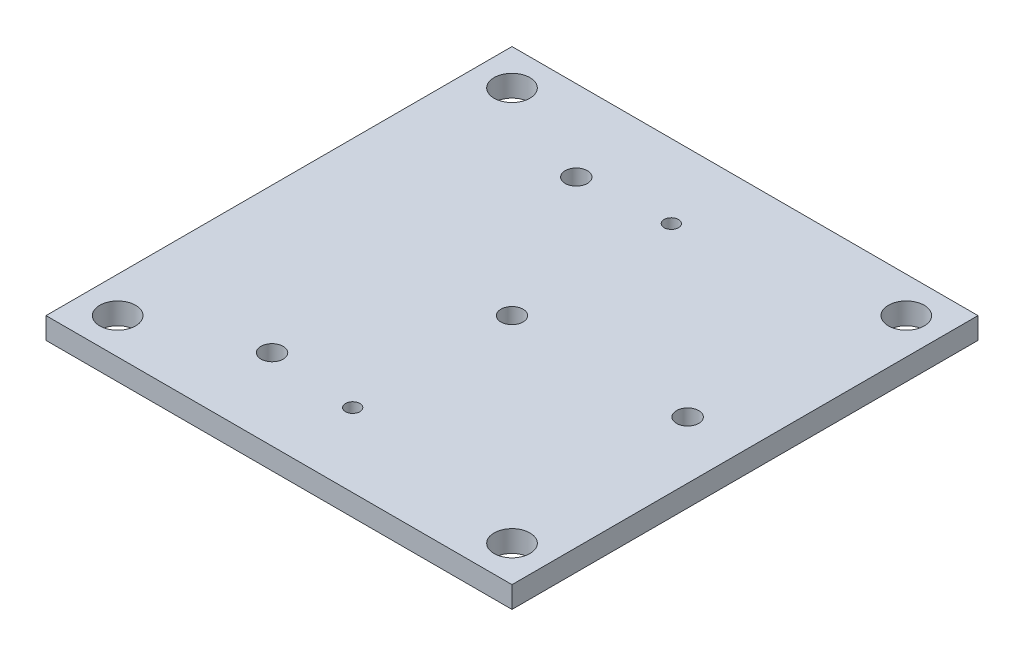
ISO-10303-21;
HEADER;
FILE_DESCRIPTION(('STEP AP214'),'2;1');
FILE_NAME('part.step','',(''),(''),'','','');
FILE_SCHEMA(('AUTOMOTIVE_DESIGN { 1 0 10303 214 1 1 1 1 }'));
ENDSEC;
DATA;
#1=APPLICATION_CONTEXT('core data for automotive mechanical design processes');
#2=APPLICATION_PROTOCOL_DEFINITION('international standard','automotive_design',2000,#1);
#3=PRODUCT_CONTEXT('',#1,'mechanical');
#4=PRODUCT('Part','Part','',(#3));
#5=PRODUCT_RELATED_PRODUCT_CATEGORY('part','',(#4));
#6=PRODUCT_DEFINITION_FORMATION('','',#4);
#7=PRODUCT_DEFINITION_CONTEXT('part definition',#1,'design');
#8=PRODUCT_DEFINITION('design','',#6,#7);
#9=PRODUCT_DEFINITION_SHAPE('','',#8);
#10=(LENGTH_UNIT() NAMED_UNIT(*) SI_UNIT(.MILLI.,.METRE.));
#11=(NAMED_UNIT(*) PLANE_ANGLE_UNIT() SI_UNIT($,.RADIAN.));
#12=(NAMED_UNIT(*) SI_UNIT($,.STERADIAN.) SOLID_ANGLE_UNIT());
#13=UNCERTAINTY_MEASURE_WITH_UNIT(LENGTH_MEASURE(1.E-05),#10,'distance_accuracy_value','');
#14=(GEOMETRIC_REPRESENTATION_CONTEXT(3) GLOBAL_UNCERTAINTY_ASSIGNED_CONTEXT((#13)) GLOBAL_UNIT_ASSIGNED_CONTEXT((#10,
#11,#12)) REPRESENTATION_CONTEXT('',''));
#15=CARTESIAN_POINT('',(0.,0.,0.));
#16=DIRECTION('',(0.,0.,1.));
#17=DIRECTION('',(1.,0.,0.));
#18=AXIS2_PLACEMENT_3D('',#15,#16,#17);
#19=CARTESIAN_POINT('',(2814.77975606686,1797.,-929.5));
#20=DIRECTION('',(0.,-1.,0.));
#21=DIRECTION('',(0.,0.,-1.));
#22=AXIS2_PLACEMENT_3D('',#19,#20,#21);
#23=PLANE('',#22);
#24=CARTESIAN_POINT('',(2790.27975606686,1797.,-971.935244785437));
#25=DIRECTION('',(0.,1.,0.));
#26=DIRECTION('',(0.,0.,1.));
#27=AXIS2_PLACEMENT_3D('',#24,#25,#26);
#28=CIRCLE('',#27,3.09999999999999);
#29=CARTESIAN_POINT('',(2790.27975606686,1797.,-968.835244785437));
#30=VERTEX_POINT('',#29);
#31=EDGE_CURVE('E355',#30,#30,#28,.T.);
#32=ORIENTED_EDGE('',*,*,#31,.T.);
#33=EDGE_LOOP('',(#32));
#34=FACE_BOUND('',#33,.T.);
#35=CARTESIAN_POINT('',(2790.27975606686,1797.,-887.06475521456));
#36=DIRECTION('',(0.,1.,0.));
#37=DIRECTION('',(0.,0.,1.));
#38=AXIS2_PLACEMENT_3D('',#35,#36,#37);
#39=CIRCLE('',#38,3.09999999999952);
#40=CARTESIAN_POINT('',(2790.27975606686,1797.,-883.964755214561));
#41=VERTEX_POINT('',#40);
#42=EDGE_CURVE('E351',#41,#41,#39,.T.);
#43=ORIENTED_EDGE('',*,*,#42,.T.);
#44=EDGE_LOOP('',(#43));
#45=FACE_BOUND('',#44,.T.);
#46=CARTESIAN_POINT('',(2863.77975606686,1797.,-929.5));
#47=DIRECTION('',(0.,1.,0.));
#48=DIRECTION('',(0.,0.,1.));
#49=AXIS2_PLACEMENT_3D('',#46,#47,#48);
#50=CIRCLE('',#49,3.09999999999997);
#51=CARTESIAN_POINT('',(2863.77975606686,1797.,-926.4));
#52=VERTEX_POINT('',#51);
#53=EDGE_CURVE('E348',#52,#52,#50,.T.);
#54=ORIENTED_EDGE('',*,*,#53,.T.);
#55=EDGE_LOOP('',(#54));
#56=FACE_BOUND('',#55,.T.);
#57=CARTESIAN_POINT('',(2814.77975606686,1797.,-929.5));
#58=DIRECTION('',(0.,1.,0.));
#59=DIRECTION('',(0.,0.,1.));
#60=AXIS2_PLACEMENT_3D('',#57,#58,#59);
#61=CIRCLE('',#60,3.09999999999997);
#62=CARTESIAN_POINT('',(2814.77975606686,1797.,-926.4));
#63=VERTEX_POINT('',#62);
#64=EDGE_CURVE('E337',#63,#63,#61,.T.);
#65=ORIENTED_EDGE('',*,*,#64,.T.);
#66=EDGE_LOOP('',(#65));
#67=FACE_BOUND('',#66,.T.);
#68=CARTESIAN_POINT('',(2814.77975606686,1797.,-885.05));
#69=DIRECTION('',(0.,-1.,0.));
#70=DIRECTION('',(0.,0.,-1.));
#71=AXIS2_PLACEMENT_3D('',#68,#69,#70);
#72=CIRCLE('',#71,1.99999999999965);
#73=CARTESIAN_POINT('',(2814.77975606686,1797.,-887.05));
#74=VERTEX_POINT('',#73);
#75=EDGE_CURVE('E336',#74,#74,#72,.T.);
#76=ORIENTED_EDGE('',*,*,#75,.F.);
#77=EDGE_LOOP('',(#76));
#78=FACE_BOUND('',#77,.T.);
#79=CARTESIAN_POINT('',(2814.77975606686,1797.,-973.95));
#80=DIRECTION('',(0.,-1.,0.));
#81=DIRECTION('',(0.,0.,-1.));
#82=AXIS2_PLACEMENT_3D('',#79,#80,#81);
#83=CIRCLE('',#82,1.99999999999965);
#84=CARTESIAN_POINT('',(2814.77975606686,1797.,-975.95));
#85=VERTEX_POINT('',#84);
#86=EDGE_CURVE('E105',#85,#85,#83,.T.);
#87=ORIENTED_EDGE('',*,*,#86,.F.);
#88=EDGE_LOOP('',(#87));
#89=FACE_BOUND('',#88,.T.);
#90=CARTESIAN_POINT('',(2869.77975606686,1797.,-984.5));
#91=DIRECTION('',(0.,-1.,0.));
#92=DIRECTION('',(0.,0.,-1.));
#93=AXIS2_PLACEMENT_3D('',#90,#91,#92);
#94=CIRCLE('',#93,4.99999999999983);
#95=CARTESIAN_POINT('',(2869.77975606686,1797.,-989.5));
#96=VERTEX_POINT('',#95);
#97=EDGE_CURVE('E101',#96,#96,#94,.T.);
#98=ORIENTED_EDGE('',*,*,#97,.F.);
#99=EDGE_LOOP('',(#98));
#100=FACE_BOUND('',#99,.T.);
#101=CARTESIAN_POINT('',(2759.77975606686,1797.,-984.500000000001));
#102=DIRECTION('',(0.,-1.,0.));
#103=DIRECTION('',(0.,0.,-1.));
#104=AXIS2_PLACEMENT_3D('',#101,#102,#103);
#105=CIRCLE('',#104,4.99999999999983);
#106=CARTESIAN_POINT('',(2759.77975606686,1797.,-989.500000000001));
#107=VERTEX_POINT('',#106);
#108=EDGE_CURVE('E104',#107,#107,#105,.T.);
#109=ORIENTED_EDGE('',*,*,#108,.F.);
#110=EDGE_LOOP('',(#109));
#111=FACE_BOUND('',#110,.T.);
#112=CARTESIAN_POINT('',(2759.77975606686,1797.,-874.500000000001));
#113=DIRECTION('',(0.,-1.,0.));
#114=DIRECTION('',(0.,0.,-1.));
#115=AXIS2_PLACEMENT_3D('',#112,#113,#114);
#116=CIRCLE('',#115,4.99999999999983);
#117=CARTESIAN_POINT('',(2759.77975606686,1797.,-879.500000000001));
#118=VERTEX_POINT('',#117);
#119=EDGE_CURVE('E108',#118,#118,#116,.T.);
#120=ORIENTED_EDGE('',*,*,#119,.F.);
#121=EDGE_LOOP('',(#120));
#122=FACE_BOUND('',#121,.T.);
#123=CARTESIAN_POINT('',(2869.77975606686,1797.,-874.5));
#124=DIRECTION('',(0.,-1.,0.));
#125=DIRECTION('',(0.,0.,-1.));
#126=AXIS2_PLACEMENT_3D('',#123,#124,#125);
#127=CIRCLE('',#126,4.99999999999983);
#128=CARTESIAN_POINT('',(2869.77975606686,1797.,-879.5));
#129=VERTEX_POINT('',#128);
#130=EDGE_CURVE('E111',#129,#129,#127,.T.);
#131=ORIENTED_EDGE('',*,*,#130,.F.);
#132=EDGE_LOOP('',(#131));
#133=FACE_BOUND('',#132,.T.);
#134=DIRECTION('',(0.,0.,1.));
#135=VECTOR('',#134,1.);
#136=CARTESIAN_POINT('',(2879.77975606686,1797.,0.));
#137=LINE('',#136,#135);
#138=CARTESIAN_POINT('',(2879.77975606686,1797.,-994.5));
#139=VERTEX_POINT('',#138);
#140=CARTESIAN_POINT('',(2879.77975606686,1797.,-864.5));
#141=VERTEX_POINT('',#140);
#142=EDGE_CURVE('E114',#139,#141,#137,.T.);
#143=ORIENTED_EDGE('',*,*,#142,.T.);
#144=DIRECTION('',(-1.,0.,0.));
#145=VECTOR('',#144,1.);
#146=CARTESIAN_POINT('',(0.,1797.,-864.5));
#147=LINE('',#146,#145);
#148=CARTESIAN_POINT('',(2749.77975606686,1797.,-864.5));
#149=VERTEX_POINT('',#148);
#150=EDGE_CURVE('E117',#141,#149,#147,.T.);
#151=ORIENTED_EDGE('',*,*,#150,.T.);
#152=DIRECTION('',(0.,0.,-1.));
#153=VECTOR('',#152,1.);
#154=CARTESIAN_POINT('',(2749.77975606686,1797.,0.));
#155=LINE('',#154,#153);
#156=CARTESIAN_POINT('',(2749.77975606686,1797.,-994.5));
#157=VERTEX_POINT('',#156);
#158=EDGE_CURVE('E87',#149,#157,#155,.T.);
#159=ORIENTED_EDGE('',*,*,#158,.T.);
#160=DIRECTION('',(1.,0.,0.));
#161=VECTOR('',#160,1.);
#162=CARTESIAN_POINT('',(0.,1797.,-994.5));
#163=LINE('',#162,#161);
#164=EDGE_CURVE('E120',#157,#139,#163,.T.);
#165=ORIENTED_EDGE('',*,*,#164,.T.);
#166=EDGE_LOOP('',(#143,#151,#159,#165));
#167=FACE_BOUND('',#166,.T.);
#168=ADVANCED_FACE('F36',(#34,#45,#56,#67,#78,#89,#100,#111,#122,#133,#167),#23,.T.);
#169=CARTESIAN_POINT('',(2814.77975606686,1803.,-929.5));
#170=DIRECTION('',(0.,-1.,0.));
#171=DIRECTION('',(0.,0.,-1.));
#172=AXIS2_PLACEMENT_3D('',#169,#170,#171);
#173=PLANE('',#172);
#174=CARTESIAN_POINT('',(2790.27975606686,1803.,-971.935244785437));
#175=DIRECTION('',(0.,1.,0.));
#176=DIRECTION('',(0.,0.,1.));
#177=AXIS2_PLACEMENT_3D('',#174,#175,#176);
#178=CIRCLE('',#177,3.09999999999999);
#179=CARTESIAN_POINT('',(2790.27975606686,1803.,-968.835244785437));
#180=VERTEX_POINT('',#179);
#181=EDGE_CURVE('E311',#180,#180,#178,.T.);
#182=ORIENTED_EDGE('',*,*,#181,.F.);
#183=EDGE_LOOP('',(#182));
#184=FACE_BOUND('',#183,.T.);
#185=CARTESIAN_POINT('',(2790.27975606686,1803.,-887.06475521456));
#186=DIRECTION('',(0.,1.,0.));
#187=DIRECTION('',(0.,0.,1.));
#188=AXIS2_PLACEMENT_3D('',#185,#186,#187);
#189=CIRCLE('',#188,3.09999999999952);
#190=CARTESIAN_POINT('',(2790.27975606686,1803.,-883.964755214561));
#191=VERTEX_POINT('',#190);
#192=EDGE_CURVE('E315',#191,#191,#189,.T.);
#193=ORIENTED_EDGE('',*,*,#192,.F.);
#194=EDGE_LOOP('',(#193));
#195=FACE_BOUND('',#194,.T.);
#196=CARTESIAN_POINT('',(2863.77975606686,1803.,-929.5));
#197=DIRECTION('',(0.,1.,0.));
#198=DIRECTION('',(0.,0.,1.));
#199=AXIS2_PLACEMENT_3D('',#196,#197,#198);
#200=CIRCLE('',#199,3.09999999999997);
#201=CARTESIAN_POINT('',(2863.77975606686,1803.,-926.4));
#202=VERTEX_POINT('',#201);
#203=EDGE_CURVE('E319',#202,#202,#200,.T.);
#204=ORIENTED_EDGE('',*,*,#203,.F.);
#205=EDGE_LOOP('',(#204));
#206=FACE_BOUND('',#205,.T.);
#207=CARTESIAN_POINT('',(2814.77975606686,1803.,-929.5));
#208=DIRECTION('',(0.,1.,0.));
#209=DIRECTION('',(0.,0.,1.));
#210=AXIS2_PLACEMENT_3D('',#207,#208,#209);
#211=CIRCLE('',#210,3.09999999999997);
#212=CARTESIAN_POINT('',(2814.77975606686,1803.,-926.4));
#213=VERTEX_POINT('',#212);
#214=EDGE_CURVE('E323',#213,#213,#211,.T.);
#215=ORIENTED_EDGE('',*,*,#214,.F.);
#216=EDGE_LOOP('',(#215));
#217=FACE_BOUND('',#216,.T.);
#218=CARTESIAN_POINT('',(2814.77975606686,1803.,-973.95));
#219=DIRECTION('',(0.,-1.,0.));
#220=DIRECTION('',(0.,0.,-1.));
#221=AXIS2_PLACEMENT_3D('',#218,#219,#220);
#222=CIRCLE('',#221,1.99999999999965);
#223=CARTESIAN_POINT('',(2814.77975606686,1803.,-975.95));
#224=VERTEX_POINT('',#223);
#225=EDGE_CURVE('E327',#224,#224,#222,.T.);
#226=ORIENTED_EDGE('',*,*,#225,.T.);
#227=EDGE_LOOP('',(#226));
#228=FACE_BOUND('',#227,.T.);
#229=CARTESIAN_POINT('',(2814.77975606686,1803.,-885.05));
#230=DIRECTION('',(0.,-1.,0.));
#231=DIRECTION('',(0.,0.,-1.));
#232=AXIS2_PLACEMENT_3D('',#229,#230,#231);
#233=CIRCLE('',#232,1.99999999999965);
#234=CARTESIAN_POINT('',(2814.77975606686,1803.,-887.05));
#235=VERTEX_POINT('',#234);
#236=EDGE_CURVE('E330',#235,#235,#233,.T.);
#237=ORIENTED_EDGE('',*,*,#236,.T.);
#238=EDGE_LOOP('',(#237));
#239=FACE_BOUND('',#238,.T.);
#240=CARTESIAN_POINT('',(2869.77975606686,1803.,-984.5));
#241=DIRECTION('',(0.,-1.,0.));
#242=DIRECTION('',(0.,0.,-1.));
#243=AXIS2_PLACEMENT_3D('',#240,#241,#242);
#244=CIRCLE('',#243,4.99999999999983);
#245=CARTESIAN_POINT('',(2869.77975606686,1803.,-989.5));
#246=VERTEX_POINT('',#245);
#247=EDGE_CURVE('E122',#246,#246,#244,.T.);
#248=ORIENTED_EDGE('',*,*,#247,.T.);
#249=EDGE_LOOP('',(#248));
#250=FACE_BOUND('',#249,.T.);
#251=CARTESIAN_POINT('',(2759.77975606686,1803.,-984.500000000001));
#252=DIRECTION('',(0.,-1.,0.));
#253=DIRECTION('',(0.,0.,-1.));
#254=AXIS2_PLACEMENT_3D('',#251,#252,#253);
#255=CIRCLE('',#254,4.99999999999983);
#256=CARTESIAN_POINT('',(2759.77975606686,1803.,-989.500000000001));
#257=VERTEX_POINT('',#256);
#258=EDGE_CURVE('E126',#257,#257,#255,.T.);
#259=ORIENTED_EDGE('',*,*,#258,.T.);
#260=EDGE_LOOP('',(#259));
#261=FACE_BOUND('',#260,.T.);
#262=CARTESIAN_POINT('',(2759.77975606686,1803.,-874.500000000001));
#263=DIRECTION('',(0.,-1.,0.));
#264=DIRECTION('',(0.,0.,-1.));
#265=AXIS2_PLACEMENT_3D('',#262,#263,#264);
#266=CIRCLE('',#265,4.99999999999983);
#267=CARTESIAN_POINT('',(2759.77975606686,1803.,-879.500000000001));
#268=VERTEX_POINT('',#267);
#269=EDGE_CURVE('E131',#268,#268,#266,.T.);
#270=ORIENTED_EDGE('',*,*,#269,.T.);
#271=EDGE_LOOP('',(#270));
#272=FACE_BOUND('',#271,.T.);
#273=CARTESIAN_POINT('',(2869.77975606686,1803.,-874.5));
#274=DIRECTION('',(0.,-1.,0.));
#275=DIRECTION('',(0.,0.,-1.));
#276=AXIS2_PLACEMENT_3D('',#273,#274,#275);
#277=CIRCLE('',#276,4.99999999999983);
#278=CARTESIAN_POINT('',(2869.77975606686,1803.,-879.5));
#279=VERTEX_POINT('',#278);
#280=EDGE_CURVE('E96',#279,#279,#277,.T.);
#281=ORIENTED_EDGE('',*,*,#280,.T.);
#282=EDGE_LOOP('',(#281));
#283=FACE_BOUND('',#282,.T.);
#284=DIRECTION('',(0.,0.,1.));
#285=VECTOR('',#284,1.);
#286=CARTESIAN_POINT('',(2879.77975606686,1803.,0.));
#287=LINE('',#286,#285);
#288=CARTESIAN_POINT('',(2879.77975606686,1803.,-994.5));
#289=VERTEX_POINT('',#288);
#290=CARTESIAN_POINT('',(2879.77975606686,1803.,-864.5));
#291=VERTEX_POINT('',#290);
#292=EDGE_CURVE('E94',#289,#291,#287,.T.);
#293=ORIENTED_EDGE('',*,*,#292,.F.);
#294=DIRECTION('',(1.,0.,0.));
#295=VECTOR('',#294,1.);
#296=CARTESIAN_POINT('',(0.,1803.,-994.5));
#297=LINE('',#296,#295);
#298=CARTESIAN_POINT('',(2749.77975606686,1803.,-994.5));
#299=VERTEX_POINT('',#298);
#300=EDGE_CURVE('E91',#299,#289,#297,.T.);
#301=ORIENTED_EDGE('',*,*,#300,.F.);
#302=DIRECTION('',(0.,0.,-1.));
#303=VECTOR('',#302,1.);
#304=CARTESIAN_POINT('',(2749.77975606686,1803.,0.));
#305=LINE('',#304,#303);
#306=CARTESIAN_POINT('',(2749.77975606686,1803.,-864.5));
#307=VERTEX_POINT('',#306);
#308=EDGE_CURVE('E85',#307,#299,#305,.T.);
#309=ORIENTED_EDGE('',*,*,#308,.F.);
#310=DIRECTION('',(-1.,0.,0.));
#311=VECTOR('',#310,1.);
#312=CARTESIAN_POINT('',(0.,1803.,-864.5));
#313=LINE('',#312,#311);
#314=EDGE_CURVE('E90',#291,#307,#313,.T.);
#315=ORIENTED_EDGE('',*,*,#314,.F.);
#316=EDGE_LOOP('',(#293,#301,#309,#315));
#317=FACE_BOUND('',#316,.T.);
#318=ADVANCED_FACE('F38',(#184,#195,#206,#217,#228,#239,#250,#261,#272,#283,#317),#173,.F.);
#319=CARTESIAN_POINT('',(2879.77975606686,1803.,0.));
#320=DIRECTION('',(1.,0.,0.));
#321=DIRECTION('',(0.,0.,-1.));
#322=AXIS2_PLACEMENT_3D('',#319,#320,#321);
#323=PLANE('',#322);
#324=ORIENTED_EDGE('',*,*,#142,.F.);
#325=DIRECTION('',(0.,-1.,0.));
#326=VECTOR('',#325,1.);
#327=CARTESIAN_POINT('',(2879.77975606686,1803.,-994.5));
#328=LINE('',#327,#326);
#329=EDGE_CURVE('E11',#289,#139,#328,.T.);
#330=ORIENTED_EDGE('',*,*,#329,.F.);
#331=ORIENTED_EDGE('',*,*,#292,.T.);
#332=DIRECTION('',(0.,-1.,0.));
#333=VECTOR('',#332,1.);
#334=CARTESIAN_POINT('',(2879.77975606686,1803.,-864.5));
#335=LINE('',#334,#333);
#336=EDGE_CURVE('E40',#291,#141,#335,.T.);
#337=ORIENTED_EDGE('',*,*,#336,.T.);
#338=EDGE_LOOP('',(#324,#330,#331,#337));
#339=FACE_BOUND('',#338,.T.);
#340=ADVANCED_FACE('F150',(#339),#323,.T.);
#341=CARTESIAN_POINT('',(0.,1803.,-994.5));
#342=DIRECTION('',(0.,0.,-1.));
#343=DIRECTION('',(-1.,0.,0.));
#344=AXIS2_PLACEMENT_3D('',#341,#342,#343);
#345=PLANE('',#344);
#346=ORIENTED_EDGE('',*,*,#164,.F.);
#347=DIRECTION('',(0.,-1.,0.));
#348=VECTOR('',#347,1.);
#349=CARTESIAN_POINT('',(2749.77975606686,1803.,-994.5));
#350=LINE('',#349,#348);
#351=EDGE_CURVE('E46',#299,#157,#350,.T.);
#352=ORIENTED_EDGE('',*,*,#351,.F.);
#353=ORIENTED_EDGE('',*,*,#300,.T.);
#354=ORIENTED_EDGE('',*,*,#329,.T.);
#355=EDGE_LOOP('',(#346,#352,#353,#354));
#356=FACE_BOUND('',#355,.T.);
#357=ADVANCED_FACE('F151',(#356),#345,.T.);
#358=CARTESIAN_POINT('',(2749.77975606686,1803.,0.));
#359=DIRECTION('',(-1.,0.,0.));
#360=DIRECTION('',(0.,0.,1.));
#361=AXIS2_PLACEMENT_3D('',#358,#359,#360);
#362=PLANE('',#361);
#363=ORIENTED_EDGE('',*,*,#158,.F.);
#364=DIRECTION('',(0.,-1.,0.));
#365=VECTOR('',#364,1.);
#366=CARTESIAN_POINT('',(2749.77975606686,1803.,-864.5));
#367=LINE('',#366,#365);
#368=EDGE_CURVE('E82',#307,#149,#367,.T.);
#369=ORIENTED_EDGE('',*,*,#368,.F.);
#370=ORIENTED_EDGE('',*,*,#308,.T.);
#371=ORIENTED_EDGE('',*,*,#351,.T.);
#372=EDGE_LOOP('',(#363,#369,#370,#371));
#373=FACE_BOUND('',#372,.T.);
#374=ADVANCED_FACE('F84',(#373),#362,.T.);
#375=CARTESIAN_POINT('',(2869.77975606686,1803.,-874.5));
#376=DIRECTION('',(0.,-1.,0.));
#377=DIRECTION('',(0.,0.,-1.));
#378=AXIS2_PLACEMENT_3D('',#375,#376,#377);
#379=CYLINDRICAL_SURFACE('',#378,4.99999999999983);
#380=ORIENTED_EDGE('',*,*,#280,.F.);
#381=EDGE_LOOP('',(#380));
#382=FACE_BOUND('',#381,.T.);
#383=ORIENTED_EDGE('',*,*,#130,.T.);
#384=EDGE_LOOP('',(#383));
#385=FACE_BOUND('',#384,.T.);
#386=ADVANCED_FACE('F141',(#382,#385),#379,.F.);
#387=CARTESIAN_POINT('',(2759.77975606686,1803.,-874.500000000001));
#388=DIRECTION('',(0.,-1.,0.));
#389=DIRECTION('',(0.,0.,-1.));
#390=AXIS2_PLACEMENT_3D('',#387,#388,#389);
#391=CYLINDRICAL_SURFACE('',#390,4.99999999999983);
#392=ORIENTED_EDGE('',*,*,#269,.F.);
#393=EDGE_LOOP('',(#392));
#394=FACE_BOUND('',#393,.T.);
#395=ORIENTED_EDGE('',*,*,#119,.T.);
#396=EDGE_LOOP('',(#395));
#397=FACE_BOUND('',#396,.T.);
#398=ADVANCED_FACE('F144',(#394,#397),#391,.F.);
#399=CARTESIAN_POINT('',(2759.77975606686,1803.,-984.500000000001));
#400=DIRECTION('',(0.,-1.,0.));
#401=DIRECTION('',(0.,0.,-1.));
#402=AXIS2_PLACEMENT_3D('',#399,#400,#401);
#403=CYLINDRICAL_SURFACE('',#402,4.99999999999983);
#404=ORIENTED_EDGE('',*,*,#258,.F.);
#405=EDGE_LOOP('',(#404));
#406=FACE_BOUND('',#405,.T.);
#407=ORIENTED_EDGE('',*,*,#108,.T.);
#408=EDGE_LOOP('',(#407));
#409=FACE_BOUND('',#408,.T.);
#410=ADVANCED_FACE('F169',(#406,#409),#403,.F.);
#411=CARTESIAN_POINT('',(2869.77975606686,1803.,-984.5));
#412=DIRECTION('',(0.,-1.,0.));
#413=DIRECTION('',(0.,0.,-1.));
#414=AXIS2_PLACEMENT_3D('',#411,#412,#413);
#415=CYLINDRICAL_SURFACE('',#414,4.99999999999983);
#416=ORIENTED_EDGE('',*,*,#247,.F.);
#417=EDGE_LOOP('',(#416));
#418=FACE_BOUND('',#417,.T.);
#419=ORIENTED_EDGE('',*,*,#97,.T.);
#420=EDGE_LOOP('',(#419));
#421=FACE_BOUND('',#420,.T.);
#422=ADVANCED_FACE('F165',(#418,#421),#415,.F.);
#423=CARTESIAN_POINT('',(0.,1803.,-864.5));
#424=DIRECTION('',(0.,0.,1.));
#425=DIRECTION('',(1.,0.,0.));
#426=AXIS2_PLACEMENT_3D('',#423,#424,#425);
#427=PLANE('',#426);
#428=ORIENTED_EDGE('',*,*,#150,.F.);
#429=ORIENTED_EDGE('',*,*,#336,.F.);
#430=ORIENTED_EDGE('',*,*,#314,.T.);
#431=ORIENTED_EDGE('',*,*,#368,.T.);
#432=EDGE_LOOP('',(#428,#429,#430,#431));
#433=FACE_BOUND('',#432,.T.);
#434=ADVANCED_FACE('F93',(#433),#427,.T.);
#435=CARTESIAN_POINT('',(2814.77975606686,1779.,-973.95));
#436=DIRECTION('',(0.,1.,0.));
#437=DIRECTION('',(0.,0.,1.));
#438=AXIS2_PLACEMENT_3D('',#435,#436,#437);
#439=CYLINDRICAL_SURFACE('',#438,1.99999999999965);
#440=ORIENTED_EDGE('',*,*,#86,.T.);
#441=EDGE_LOOP('',(#440));
#442=FACE_BOUND('',#441,.T.);
#443=ORIENTED_EDGE('',*,*,#225,.F.);
#444=EDGE_LOOP('',(#443));
#445=FACE_BOUND('',#444,.T.);
#446=ADVANCED_FACE('F161',(#442,#445),#439,.F.);
#447=CARTESIAN_POINT('',(2814.77975606686,1779.,-885.05));
#448=DIRECTION('',(0.,1.,0.));
#449=DIRECTION('',(0.,0.,1.));
#450=AXIS2_PLACEMENT_3D('',#447,#448,#449);
#451=CYLINDRICAL_SURFACE('',#450,1.99999999999965);
#452=ORIENTED_EDGE('',*,*,#75,.T.);
#453=EDGE_LOOP('',(#452));
#454=FACE_BOUND('',#453,.T.);
#455=ORIENTED_EDGE('',*,*,#236,.F.);
#456=EDGE_LOOP('',(#455));
#457=FACE_BOUND('',#456,.T.);
#458=ADVANCED_FACE('F199',(#454,#457),#451,.F.);
#459=CARTESIAN_POINT('',(2814.77975606686,1797.,-929.5));
#460=DIRECTION('',(0.,1.,0.));
#461=DIRECTION('',(0.,0.,1.));
#462=AXIS2_PLACEMENT_3D('',#459,#460,#461);
#463=CYLINDRICAL_SURFACE('',#462,3.09999999999997);
#464=ORIENTED_EDGE('',*,*,#64,.F.);
#465=EDGE_LOOP('',(#464));
#466=FACE_BOUND('',#465,.T.);
#467=ORIENTED_EDGE('',*,*,#214,.T.);
#468=EDGE_LOOP('',(#467));
#469=FACE_BOUND('',#468,.T.);
#470=ADVANCED_FACE('F206',(#466,#469),#463,.F.);
#471=CARTESIAN_POINT('',(2863.77975606686,1797.,-929.5));
#472=DIRECTION('',(0.,1.,0.));
#473=DIRECTION('',(0.,0.,1.));
#474=AXIS2_PLACEMENT_3D('',#471,#472,#473);
#475=CYLINDRICAL_SURFACE('',#474,3.09999999999997);
#476=ORIENTED_EDGE('',*,*,#53,.F.);
#477=EDGE_LOOP('',(#476));
#478=FACE_BOUND('',#477,.T.);
#479=ORIENTED_EDGE('',*,*,#203,.T.);
#480=EDGE_LOOP('',(#479));
#481=FACE_BOUND('',#480,.T.);
#482=ADVANCED_FACE('F213',(#478,#481),#475,.F.);
#483=CARTESIAN_POINT('',(2790.27975606686,1797.,-887.06475521456));
#484=DIRECTION('',(0.,1.,0.));
#485=DIRECTION('',(0.,0.,1.));
#486=AXIS2_PLACEMENT_3D('',#483,#484,#485);
#487=CYLINDRICAL_SURFACE('',#486,3.09999999999952);
#488=ORIENTED_EDGE('',*,*,#42,.F.);
#489=EDGE_LOOP('',(#488));
#490=FACE_BOUND('',#489,.T.);
#491=ORIENTED_EDGE('',*,*,#192,.T.);
#492=EDGE_LOOP('',(#491));
#493=FACE_BOUND('',#492,.T.);
#494=ADVANCED_FACE('F222',(#490,#493),#487,.F.);
#495=CARTESIAN_POINT('',(2790.27975606686,1797.,-971.935244785437));
#496=DIRECTION('',(0.,1.,0.));
#497=DIRECTION('',(0.,0.,1.));
#498=AXIS2_PLACEMENT_3D('',#495,#496,#497);
#499=CYLINDRICAL_SURFACE('',#498,3.09999999999999);
#500=ORIENTED_EDGE('',*,*,#31,.F.);
#501=EDGE_LOOP('',(#500));
#502=FACE_BOUND('',#501,.T.);
#503=ORIENTED_EDGE('',*,*,#181,.T.);
#504=EDGE_LOOP('',(#503));
#505=FACE_BOUND('',#504,.T.);
#506=ADVANCED_FACE('F231',(#502,#505),#499,.F.);
#507=CLOSED_SHELL('',(#168,#318,#340,#357,#374,#386,#398,#410,#422,#434,#446,#458,#470,#482,
#494,#506));
#508=MANIFOLD_SOLID_BREP('B2',#507);
#509=ADVANCED_BREP_SHAPE_REPRESENTATION('',(#18,#508),#14);
#510=SHAPE_DEFINITION_REPRESENTATION(#9,#509);
ENDSEC;
END-ISO-10303-21;
